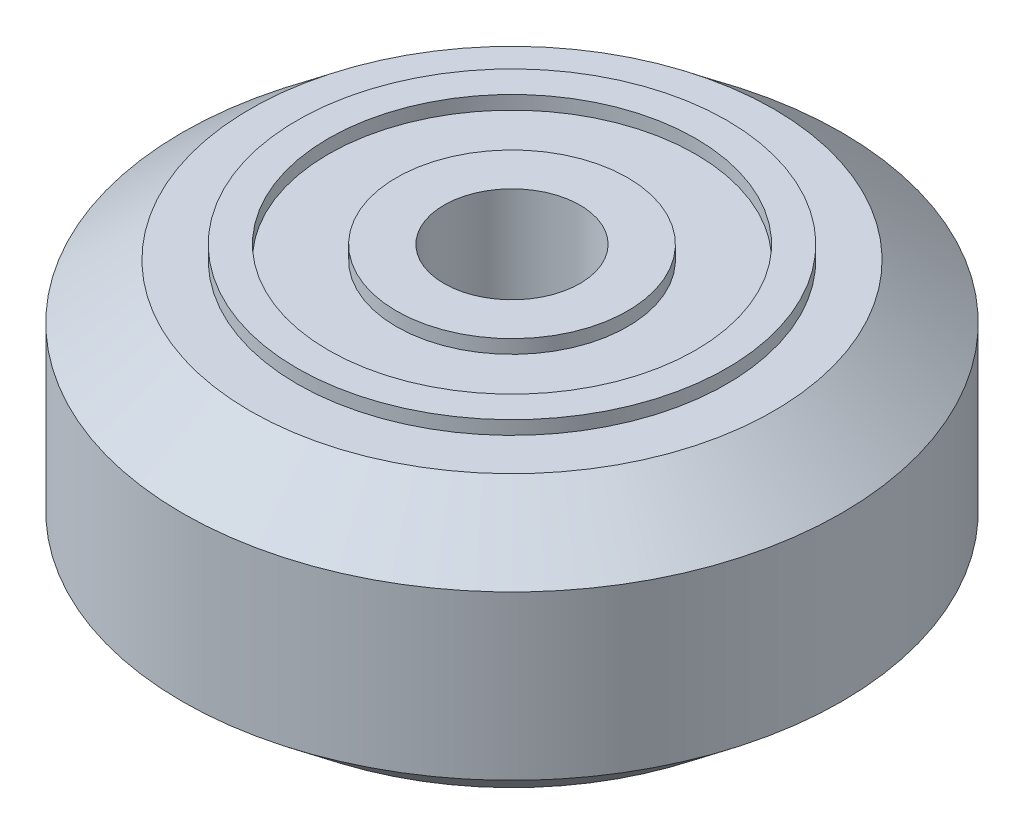
ISO-10303-21;
HEADER;
FILE_DESCRIPTION(('STEP AP214'),'2;1');
FILE_NAME('part.step','',(''),(''),'','','');
FILE_SCHEMA(('AUTOMOTIVE_DESIGN { 1 0 10303 214 1 1 1 1 }'));
ENDSEC;
DATA;
#1=APPLICATION_CONTEXT('core data for automotive mechanical design processes');
#2=APPLICATION_PROTOCOL_DEFINITION('international standard','automotive_design',2000,#1);
#3=PRODUCT_CONTEXT('',#1,'mechanical');
#4=PRODUCT('Part','Part','',(#3));
#5=PRODUCT_RELATED_PRODUCT_CATEGORY('part','',(#4));
#6=PRODUCT_DEFINITION_FORMATION('','',#4);
#7=PRODUCT_DEFINITION_CONTEXT('part definition',#1,'design');
#8=PRODUCT_DEFINITION('design','',#6,#7);
#9=PRODUCT_DEFINITION_SHAPE('','',#8);
#10=(LENGTH_UNIT() NAMED_UNIT(*) SI_UNIT(.MILLI.,.METRE.));
#11=(NAMED_UNIT(*) PLANE_ANGLE_UNIT() SI_UNIT($,.RADIAN.));
#12=(NAMED_UNIT(*) SI_UNIT($,.STERADIAN.) SOLID_ANGLE_UNIT());
#13=UNCERTAINTY_MEASURE_WITH_UNIT(LENGTH_MEASURE(1.E-05),#10,'distance_accuracy_value','');
#14=(GEOMETRIC_REPRESENTATION_CONTEXT(3) GLOBAL_UNCERTAINTY_ASSIGNED_CONTEXT((#13)) GLOBAL_UNIT_ASSIGNED_CONTEXT((#10,
#11,#12)) REPRESENTATION_CONTEXT('',''));
#15=CARTESIAN_POINT('',(0.,0.,0.));
#16=DIRECTION('',(0.,0.,1.));
#17=DIRECTION('',(1.,0.,0.));
#18=AXIS2_PLACEMENT_3D('',#15,#16,#17);
#19=CARTESIAN_POINT('',(0.,2.5,0.));
#20=DIRECTION('',(0.,1.,0.));
#21=DIRECTION('',(0.,0.,1.));
#22=AXIS2_PLACEMENT_3D('',#19,#20,#21);
#23=CONICAL_SURFACE('',#22,12.125,0.896142096038719);
#24=CARTESIAN_POINT('',(0.,2.5,0.));
#25=DIRECTION('',(0.,1.,0.));
#26=DIRECTION('',(0.,0.,1.));
#27=AXIS2_PLACEMENT_3D('',#24,#25,#26);
#28=CIRCLE('',#27,12.125);
#29=CARTESIAN_POINT('',(0.,2.5,12.125));
#30=VERTEX_POINT('',#29);
#31=EDGE_CURVE('E43',#30,#30,#28,.T.);
#32=ORIENTED_EDGE('',*,*,#31,.F.);
#33=EDGE_LOOP('',(#32));
#34=FACE_BOUND('',#33,.T.);
#35=CARTESIAN_POINT('',(0.,0.5,0.));
#36=DIRECTION('',(0.,-1.,0.));
#37=DIRECTION('',(0.,0.,-1.));
#38=AXIS2_PLACEMENT_3D('',#35,#36,#37);
#39=CIRCLE('',#38,9.62455555555555);
#40=CARTESIAN_POINT('',(0.,0.5,-9.62455555555555));
#41=VERTEX_POINT('',#40);
#42=EDGE_CURVE('E58',#41,#41,#39,.F.);
#43=ORIENTED_EDGE('',*,*,#42,.T.);
#44=EDGE_LOOP('',(#43));
#45=FACE_BOUND('',#44,.T.);
#46=ADVANCED_FACE('F36',(#34,#45),#23,.T.);
#47=CARTESIAN_POINT('',(0.,11.,0.));
#48=DIRECTION('',(0.,-1.,0.));
#49=DIRECTION('',(0.,0.,-1.));
#50=AXIS2_PLACEMENT_3D('',#47,#48,#49);
#51=CONICAL_SURFACE('',#50,8.99944444444444,0.896142096038719);
#52=CARTESIAN_POINT('',(0.,8.5,0.));
#53=DIRECTION('',(0.,1.,0.));
#54=DIRECTION('',(0.,0.,1.));
#55=AXIS2_PLACEMENT_3D('',#52,#53,#54);
#56=CIRCLE('',#55,12.125);
#57=CARTESIAN_POINT('',(0.,8.5,12.125));
#58=VERTEX_POINT('',#57);
#59=EDGE_CURVE('E47',#58,#58,#56,.T.);
#60=ORIENTED_EDGE('',*,*,#59,.T.);
#61=EDGE_LOOP('',(#60));
#62=FACE_BOUND('',#61,.T.);
#63=CARTESIAN_POINT('',(0.,10.5,0.));
#64=DIRECTION('',(0.,1.,0.));
#65=DIRECTION('',(0.,0.,1.));
#66=AXIS2_PLACEMENT_3D('',#63,#64,#65);
#67=CIRCLE('',#66,9.62455555555555);
#68=CARTESIAN_POINT('',(0.,10.5,9.62455555555555));
#69=VERTEX_POINT('',#68);
#70=EDGE_CURVE('E52',#69,#69,#67,.F.);
#71=ORIENTED_EDGE('',*,*,#70,.T.);
#72=EDGE_LOOP('',(#71));
#73=FACE_BOUND('',#72,.T.);
#74=ADVANCED_FACE('F111',(#62,#73),#51,.T.);
#75=CARTESIAN_POINT('',(0.,11.,0.));
#76=DIRECTION('',(0.,1.,0.));
#77=DIRECTION('',(0.,0.,1.));
#78=AXIS2_PLACEMENT_3D('',#75,#76,#77);
#79=CYLINDRICAL_SURFACE('',#78,12.125);
#80=ORIENTED_EDGE('',*,*,#31,.T.);
#81=EDGE_LOOP('',(#80));
#82=FACE_BOUND('',#81,.T.);
#83=ORIENTED_EDGE('',*,*,#59,.F.);
#84=EDGE_LOOP('',(#83));
#85=FACE_BOUND('',#84,.T.);
#86=ADVANCED_FACE('F106',(#82,#85),#79,.T.);
#87=CARTESIAN_POINT('',(0.,10.5,0.));
#88=DIRECTION('',(0.,1.,0.));
#89=DIRECTION('',(0.,0.,1.));
#90=AXIS2_PLACEMENT_3D('',#87,#88,#89);
#91=PLANE('',#90);
#92=ORIENTED_EDGE('',*,*,#70,.F.);
#93=EDGE_LOOP('',(#92));
#94=FACE_BOUND('',#93,.T.);
#95=CARTESIAN_POINT('',(0.,10.5,0.));
#96=DIRECTION('',(0.,1.,0.));
#97=DIRECTION('',(0.,0.,1.));
#98=AXIS2_PLACEMENT_3D('',#95,#96,#97);
#99=CIRCLE('',#98,7.9);
#100=CARTESIAN_POINT('',(0.,10.5,7.9));
#101=VERTEX_POINT('',#100);
#102=EDGE_CURVE('E57',#101,#101,#99,.T.);
#103=ORIENTED_EDGE('',*,*,#102,.F.);
#104=EDGE_LOOP('',(#103));
#105=FACE_BOUND('',#104,.T.);
#106=ADVANCED_FACE('F96',(#94,#105),#91,.T.);
#107=CARTESIAN_POINT('',(0.,10.5,0.));
#108=DIRECTION('',(0.,1.,0.));
#109=DIRECTION('',(0.,0.,1.));
#110=AXIS2_PLACEMENT_3D('',#107,#108,#109);
#111=CYLINDRICAL_SURFACE('',#110,7.9);
#112=ORIENTED_EDGE('',*,*,#102,.T.);
#113=EDGE_LOOP('',(#112));
#114=FACE_BOUND('',#113,.T.);
#115=CARTESIAN_POINT('',(0.,11.,0.));
#116=DIRECTION('',(0.,1.,0.));
#117=DIRECTION('',(0.,0.,1.));
#118=AXIS2_PLACEMENT_3D('',#115,#116,#117);
#119=CIRCLE('',#118,7.9);
#120=CARTESIAN_POINT('',(0.,11.,7.9));
#121=VERTEX_POINT('',#120);
#122=EDGE_CURVE('E85',#121,#121,#119,.T.);
#123=ORIENTED_EDGE('',*,*,#122,.F.);
#124=EDGE_LOOP('',(#123));
#125=FACE_BOUND('',#124,.T.);
#126=ADVANCED_FACE('F94',(#114,#125),#111,.T.);
#127=CARTESIAN_POINT('',(-8.99944444444444,11.,0.));
#128=DIRECTION('',(0.,1.,0.));
#129=DIRECTION('',(0.,0.,1.));
#130=AXIS2_PLACEMENT_3D('',#127,#128,#129);
#131=PLANE('',#130);
#132=CARTESIAN_POINT('',(0.,11.,0.));
#133=DIRECTION('',(0.,1.,0.));
#134=DIRECTION('',(0.,0.,1.));
#135=AXIS2_PLACEMENT_3D('',#132,#133,#134);
#136=CIRCLE('',#135,6.75);
#137=CARTESIAN_POINT('',(0.,11.,6.75));
#138=VERTEX_POINT('',#137);
#139=EDGE_CURVE('E80',#138,#138,#136,.T.);
#140=ORIENTED_EDGE('',*,*,#139,.F.);
#141=EDGE_LOOP('',(#140));
#142=FACE_BOUND('',#141,.T.);
#143=ORIENTED_EDGE('',*,*,#122,.T.);
#144=EDGE_LOOP('',(#143));
#145=FACE_BOUND('',#144,.T.);
#146=ADVANCED_FACE('F92',(#142,#145),#131,.T.);
#147=CARTESIAN_POINT('',(0.,10.5,0.));
#148=DIRECTION('',(0.,1.,0.));
#149=DIRECTION('',(0.,0.,1.));
#150=AXIS2_PLACEMENT_3D('',#147,#148,#149);
#151=CYLINDRICAL_SURFACE('',#150,6.75);
#152=CARTESIAN_POINT('',(0.,10.5,0.));
#153=DIRECTION('',(0.,1.,0.));
#154=DIRECTION('',(0.,0.,1.));
#155=AXIS2_PLACEMENT_3D('',#152,#153,#154);
#156=CIRCLE('',#155,6.75);
#157=CARTESIAN_POINT('',(0.,10.5,6.75));
#158=VERTEX_POINT('',#157);
#159=EDGE_CURVE('E82',#158,#158,#156,.T.);
#160=ORIENTED_EDGE('',*,*,#159,.F.);
#161=EDGE_LOOP('',(#160));
#162=FACE_BOUND('',#161,.T.);
#163=ORIENTED_EDGE('',*,*,#139,.T.);
#164=EDGE_LOOP('',(#163));
#165=FACE_BOUND('',#164,.T.);
#166=ADVANCED_FACE('F103',(#162,#165),#151,.F.);
#167=CARTESIAN_POINT('',(0.,10.5,0.));
#168=DIRECTION('',(0.,1.,0.));
#169=DIRECTION('',(0.,0.,1.));
#170=AXIS2_PLACEMENT_3D('',#167,#168,#169);
#171=PLANE('',#170);
#172=CARTESIAN_POINT('',(0.,10.5,0.));
#173=DIRECTION('',(0.,1.,0.));
#174=DIRECTION('',(0.,0.,1.));
#175=AXIS2_PLACEMENT_3D('',#172,#173,#174);
#176=CIRCLE('',#175,4.25);
#177=CARTESIAN_POINT('',(0.,10.5,4.25));
#178=VERTEX_POINT('',#177);
#179=EDGE_CURVE('E60',#178,#178,#176,.T.);
#180=ORIENTED_EDGE('',*,*,#179,.F.);
#181=EDGE_LOOP('',(#180));
#182=FACE_BOUND('',#181,.T.);
#183=ORIENTED_EDGE('',*,*,#159,.T.);
#184=EDGE_LOOP('',(#183));
#185=FACE_BOUND('',#184,.T.);
#186=ADVANCED_FACE('F158',(#182,#185),#171,.T.);
#187=CARTESIAN_POINT('',(0.,11.,0.));
#188=DIRECTION('',(0.,-1.,0.));
#189=DIRECTION('',(0.,0.,-1.));
#190=AXIS2_PLACEMENT_3D('',#187,#188,#189);
#191=CYLINDRICAL_SURFACE('',#190,4.25);
#192=CARTESIAN_POINT('',(0.,11.,0.));
#193=DIRECTION('',(0.,1.,0.));
#194=DIRECTION('',(0.,0.,1.));
#195=AXIS2_PLACEMENT_3D('',#192,#193,#194);
#196=CIRCLE('',#195,4.25);
#197=CARTESIAN_POINT('',(0.,11.,4.25));
#198=VERTEX_POINT('',#197);
#199=EDGE_CURVE('E65',#198,#198,#196,.T.);
#200=ORIENTED_EDGE('',*,*,#199,.F.);
#201=EDGE_LOOP('',(#200));
#202=FACE_BOUND('',#201,.T.);
#203=ORIENTED_EDGE('',*,*,#179,.T.);
#204=EDGE_LOOP('',(#203));
#205=FACE_BOUND('',#204,.T.);
#206=ADVANCED_FACE('F167',(#202,#205),#191,.T.);
#207=CARTESIAN_POINT('',(0.,11.,0.));
#208=DIRECTION('',(0.,1.,0.));
#209=DIRECTION('',(0.,0.,1.));
#210=AXIS2_PLACEMENT_3D('',#207,#208,#209);
#211=PLANE('',#210);
#212=CARTESIAN_POINT('',(0.,11.,0.));
#213=DIRECTION('',(0.,1.,0.));
#214=DIRECTION('',(0.,0.,1.));
#215=AXIS2_PLACEMENT_3D('',#212,#213,#214);
#216=CIRCLE('',#215,2.5);
#217=CARTESIAN_POINT('',(0.,11.,2.5));
#218=VERTEX_POINT('',#217);
#219=EDGE_CURVE('E280',#218,#218,#216,.T.);
#220=ORIENTED_EDGE('',*,*,#219,.F.);
#221=EDGE_LOOP('',(#220));
#222=FACE_BOUND('',#221,.T.);
#223=ORIENTED_EDGE('',*,*,#199,.T.);
#224=EDGE_LOOP('',(#223));
#225=FACE_BOUND('',#224,.T.);
#226=ADVANCED_FACE('F176',(#222,#225),#211,.T.);
#227=CARTESIAN_POINT('',(0.,0.5,0.));
#228=DIRECTION('',(0.,-1.,0.));
#229=DIRECTION('',(0.,0.,1.));
#230=AXIS2_PLACEMENT_3D('',#227,#228,#229);
#231=PLANE('',#230);
#232=ORIENTED_EDGE('',*,*,#42,.F.);
#233=EDGE_LOOP('',(#232));
#234=FACE_BOUND('',#233,.T.);
#235=CARTESIAN_POINT('',(0.,0.5,0.));
#236=DIRECTION('',(0.,1.,0.));
#237=DIRECTION('',(0.,0.,1.));
#238=AXIS2_PLACEMENT_3D('',#235,#236,#237);
#239=CIRCLE('',#238,7.9);
#240=CARTESIAN_POINT('',(0.,0.5,7.9));
#241=VERTEX_POINT('',#240);
#242=EDGE_CURVE('E61',#241,#241,#239,.T.);
#243=ORIENTED_EDGE('',*,*,#242,.T.);
#244=EDGE_LOOP('',(#243));
#245=FACE_BOUND('',#244,.T.);
#246=ADVANCED_FACE('F190',(#234,#245),#231,.T.);
#247=CARTESIAN_POINT('',(0.,0.5,0.));
#248=DIRECTION('',(0.,-1.,0.));
#249=DIRECTION('',(0.,0.,-1.));
#250=AXIS2_PLACEMENT_3D('',#247,#248,#249);
#251=CYLINDRICAL_SURFACE('',#250,7.9);
#252=ORIENTED_EDGE('',*,*,#242,.F.);
#253=EDGE_LOOP('',(#252));
#254=FACE_BOUND('',#253,.T.);
#255=CARTESIAN_POINT('',(0.,0.,0.));
#256=DIRECTION('',(0.,1.,0.));
#257=DIRECTION('',(0.,0.,1.));
#258=AXIS2_PLACEMENT_3D('',#255,#256,#257);
#259=CIRCLE('',#258,7.9);
#260=CARTESIAN_POINT('',(0.,0.,7.9));
#261=VERTEX_POINT('',#260);
#262=EDGE_CURVE('E68',#261,#261,#259,.T.);
#263=ORIENTED_EDGE('',*,*,#262,.T.);
#264=EDGE_LOOP('',(#263));
#265=FACE_BOUND('',#264,.T.);
#266=ADVANCED_FACE('F196',(#254,#265),#251,.T.);
#267=CARTESIAN_POINT('',(0.,0.,0.));
#268=DIRECTION('',(0.,-1.,0.));
#269=DIRECTION('',(0.,0.,-1.));
#270=AXIS2_PLACEMENT_3D('',#267,#268,#269);
#271=PLANE('',#270);
#272=CARTESIAN_POINT('',(0.,0.,0.));
#273=DIRECTION('',(0.,1.,0.));
#274=DIRECTION('',(0.,0.,1.));
#275=AXIS2_PLACEMENT_3D('',#272,#273,#274);
#276=CIRCLE('',#275,6.75);
#277=CARTESIAN_POINT('',(0.,0.,6.75));
#278=VERTEX_POINT('',#277);
#279=EDGE_CURVE('E76',#278,#278,#276,.T.);
#280=ORIENTED_EDGE('',*,*,#279,.T.);
#281=EDGE_LOOP('',(#280));
#282=FACE_BOUND('',#281,.T.);
#283=ORIENTED_EDGE('',*,*,#262,.F.);
#284=EDGE_LOOP('',(#283));
#285=FACE_BOUND('',#284,.T.);
#286=ADVANCED_FACE('F38',(#282,#285),#271,.T.);
#287=CARTESIAN_POINT('',(0.,0.5,0.));
#288=DIRECTION('',(0.,-1.,0.));
#289=DIRECTION('',(0.,0.,-1.));
#290=AXIS2_PLACEMENT_3D('',#287,#288,#289);
#291=CYLINDRICAL_SURFACE('',#290,6.75);
#292=CARTESIAN_POINT('',(0.,0.5,0.));
#293=DIRECTION('',(0.,1.,0.));
#294=DIRECTION('',(0.,0.,1.));
#295=AXIS2_PLACEMENT_3D('',#292,#293,#294);
#296=CIRCLE('',#295,6.75);
#297=CARTESIAN_POINT('',(0.,0.5,6.75));
#298=VERTEX_POINT('',#297);
#299=EDGE_CURVE('E73',#298,#298,#296,.T.);
#300=ORIENTED_EDGE('',*,*,#299,.T.);
#301=EDGE_LOOP('',(#300));
#302=FACE_BOUND('',#301,.T.);
#303=ORIENTED_EDGE('',*,*,#279,.F.);
#304=EDGE_LOOP('',(#303));
#305=FACE_BOUND('',#304,.T.);
#306=ADVANCED_FACE('F215',(#302,#305),#291,.F.);
#307=CARTESIAN_POINT('',(0.,0.5,0.));
#308=DIRECTION('',(0.,-1.,0.));
#309=DIRECTION('',(0.,0.,1.));
#310=AXIS2_PLACEMENT_3D('',#307,#308,#309);
#311=PLANE('',#310);
#312=CARTESIAN_POINT('',(0.,0.5,0.));
#313=DIRECTION('',(0.,-1.,0.));
#314=DIRECTION('',(0.,0.,-1.));
#315=AXIS2_PLACEMENT_3D('',#312,#313,#314);
#316=CIRCLE('',#315,4.25);
#317=CARTESIAN_POINT('',(0.,0.5,-4.25));
#318=VERTEX_POINT('',#317);
#319=EDGE_CURVE('E10',#318,#318,#316,.T.);
#320=ORIENTED_EDGE('',*,*,#319,.F.);
#321=EDGE_LOOP('',(#320));
#322=FACE_BOUND('',#321,.T.);
#323=ORIENTED_EDGE('',*,*,#299,.F.);
#324=EDGE_LOOP('',(#323));
#325=FACE_BOUND('',#324,.T.);
#326=ADVANCED_FACE('F223',(#322,#325),#311,.T.);
#327=CARTESIAN_POINT('',(0.,0.,0.));
#328=DIRECTION('',(0.,1.,0.));
#329=DIRECTION('',(0.,0.,1.));
#330=AXIS2_PLACEMENT_3D('',#327,#328,#329);
#331=CYLINDRICAL_SURFACE('',#330,4.25);
#332=CARTESIAN_POINT('',(0.,0.,0.));
#333=DIRECTION('',(0.,1.,0.));
#334=DIRECTION('',(0.,0.,1.));
#335=AXIS2_PLACEMENT_3D('',#332,#333,#334);
#336=CIRCLE('',#335,4.25);
#337=CARTESIAN_POINT('',(0.,0.,4.25));
#338=VERTEX_POINT('',#337);
#339=EDGE_CURVE('E282',#338,#338,#336,.T.);
#340=ORIENTED_EDGE('',*,*,#339,.T.);
#341=EDGE_LOOP('',(#340));
#342=FACE_BOUND('',#341,.T.);
#343=ORIENTED_EDGE('',*,*,#319,.T.);
#344=EDGE_LOOP('',(#343));
#345=FACE_BOUND('',#344,.T.);
#346=ADVANCED_FACE('F233',(#342,#345),#331,.T.);
#347=CARTESIAN_POINT('',(0.,0.,0.));
#348=DIRECTION('',(0.,-1.,0.));
#349=DIRECTION('',(0.,0.,1.));
#350=AXIS2_PLACEMENT_3D('',#347,#348,#349);
#351=PLANE('',#350);
#352=CARTESIAN_POINT('',(0.,0.,0.));
#353=DIRECTION('',(0.,1.,0.));
#354=DIRECTION('',(0.,0.,1.));
#355=AXIS2_PLACEMENT_3D('',#352,#353,#354);
#356=CIRCLE('',#355,2.5);
#357=CARTESIAN_POINT('',(0.,0.,2.5));
#358=VERTEX_POINT('',#357);
#359=EDGE_CURVE('E277',#358,#358,#356,.T.);
#360=ORIENTED_EDGE('',*,*,#359,.T.);
#361=EDGE_LOOP('',(#360));
#362=FACE_BOUND('',#361,.T.);
#363=ORIENTED_EDGE('',*,*,#339,.F.);
#364=EDGE_LOOP('',(#363));
#365=FACE_BOUND('',#364,.T.);
#366=ADVANCED_FACE('F243',(#362,#365),#351,.T.);
#367=CARTESIAN_POINT('',(0.,0.,0.));
#368=DIRECTION('',(0.,1.,0.));
#369=DIRECTION('',(0.,0.,1.));
#370=AXIS2_PLACEMENT_3D('',#367,#368,#369);
#371=CYLINDRICAL_SURFACE('',#370,2.5);
#372=ORIENTED_EDGE('',*,*,#359,.F.);
#373=EDGE_LOOP('',(#372));
#374=FACE_BOUND('',#373,.T.);
#375=ORIENTED_EDGE('',*,*,#219,.T.);
#376=EDGE_LOOP('',(#375));
#377=FACE_BOUND('',#376,.T.);
#378=ADVANCED_FACE('F260',(#374,#377),#371,.F.);
#379=CLOSED_SHELL('',(#46,#74,#86,#106,#126,#146,#166,#186,#206,#226,#246,#266,#286,#306,#326,
#346,#366,#378));
#380=MANIFOLD_SOLID_BREP('B2',#379);
#381=ADVANCED_BREP_SHAPE_REPRESENTATION('',(#18,#380),#14);
#382=SHAPE_DEFINITION_REPRESENTATION(#9,#381);
ENDSEC;
END-ISO-10303-21;
